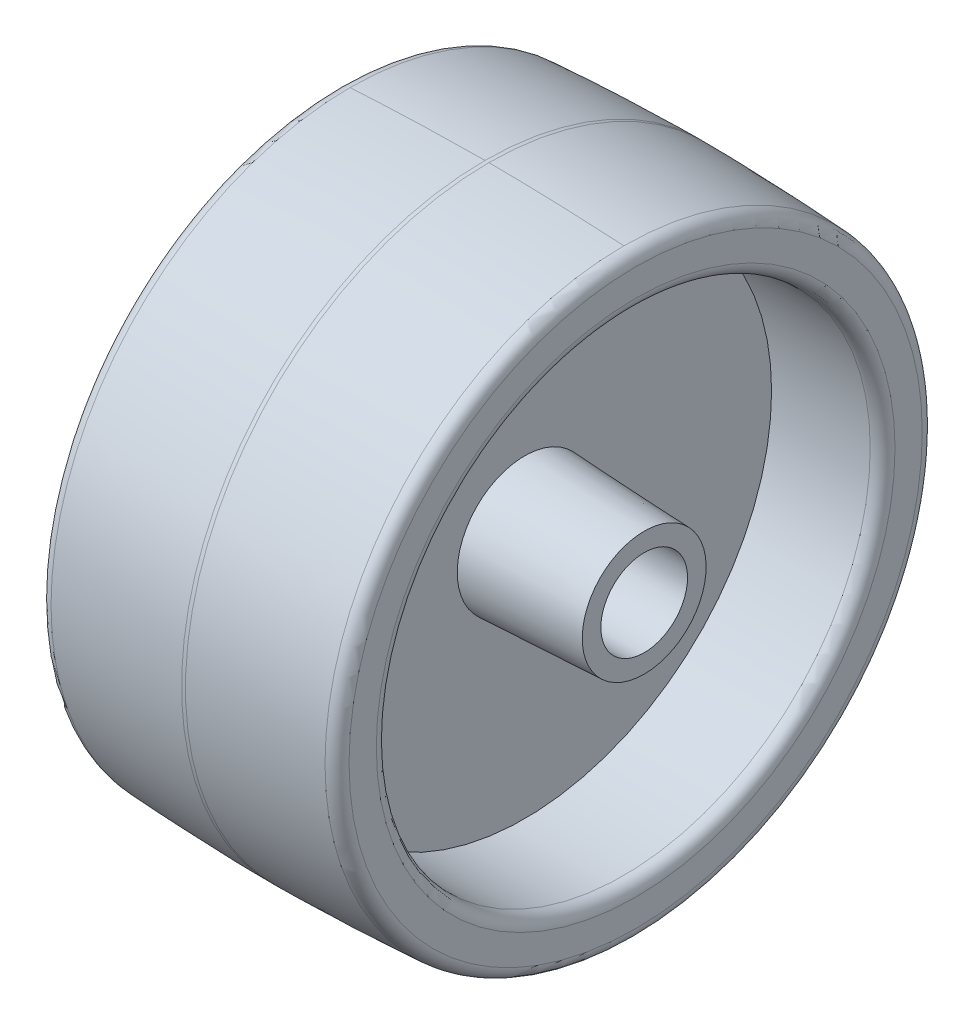
ISO-10303-21;
HEADER;
FILE_DESCRIPTION(('STEP AP214'),'2;1');
FILE_NAME('part.step','',(''),(''),'','','');
FILE_SCHEMA(('AUTOMOTIVE_DESIGN { 1 0 10303 214 1 1 1 1 }'));
ENDSEC;
DATA;
#1=APPLICATION_CONTEXT('core data for automotive mechanical design processes');
#2=APPLICATION_PROTOCOL_DEFINITION('international standard','automotive_design',2000,#1);
#3=PRODUCT_CONTEXT('',#1,'mechanical');
#4=PRODUCT('Part','Part','',(#3));
#5=PRODUCT_RELATED_PRODUCT_CATEGORY('part','',(#4));
#6=PRODUCT_DEFINITION_FORMATION('','',#4);
#7=PRODUCT_DEFINITION_CONTEXT('part definition',#1,'design');
#8=PRODUCT_DEFINITION('design','',#6,#7);
#9=PRODUCT_DEFINITION_SHAPE('','',#8);
#10=(LENGTH_UNIT() NAMED_UNIT(*) SI_UNIT(.MILLI.,.METRE.));
#11=(NAMED_UNIT(*) PLANE_ANGLE_UNIT() SI_UNIT($,.RADIAN.));
#12=(NAMED_UNIT(*) SI_UNIT($,.STERADIAN.) SOLID_ANGLE_UNIT());
#13=UNCERTAINTY_MEASURE_WITH_UNIT(LENGTH_MEASURE(1.E-05),#10,'distance_accuracy_value','');
#14=(GEOMETRIC_REPRESENTATION_CONTEXT(3) GLOBAL_UNCERTAINTY_ASSIGNED_CONTEXT((#13)) GLOBAL_UNIT_ASSIGNED_CONTEXT((#10,
#11,#12)) REPRESENTATION_CONTEXT('',''));
#15=CARTESIAN_POINT('',(0.,0.,0.));
#16=DIRECTION('',(0.,0.,1.));
#17=DIRECTION('',(1.,0.,0.));
#18=AXIS2_PLACEMENT_3D('',#15,#16,#17);
#19=CARTESIAN_POINT('',(6.,12.0397449804154,0.));
#20=DIRECTION('',(-1.,0.,0.));
#21=DIRECTION('',(0.,0.,1.));
#22=AXIS2_PLACEMENT_3D('',#19,#20,#21);
#23=PLANE('',#22);
#24=CARTESIAN_POINT('',(6.,0.,0.));
#25=DIRECTION('',(-1.,0.,0.));
#26=DIRECTION('',(0.,0.,1.));
#27=AXIS2_PLACEMENT_3D('',#24,#25,#26);
#28=CIRCLE('',#27,11.5692509922385);
#29=CARTESIAN_POINT('',(6.,0.,11.5692509922385));
#30=VERTEX_POINT('',#29);
#31=CARTESIAN_POINT('',(6.,0.,-11.5692509922385));
#32=VERTEX_POINT('',#31);
#33=EDGE_CURVE('E88',#30,#32,#28,.T.);
#34=ORIENTED_EDGE('',*,*,#33,.F.);
#35=CARTESIAN_POINT('',(6.,0.,0.));
#36=DIRECTION('',(-1.,0.,0.));
#37=DIRECTION('',(0.,0.,-1.));
#38=AXIS2_PLACEMENT_3D('',#35,#36,#37);
#39=CIRCLE('',#38,11.5692509922385);
#40=EDGE_CURVE('E125',#32,#30,#39,.T.);
#41=ORIENTED_EDGE('',*,*,#40,.F.);
#42=EDGE_LOOP('',(#34,#41));
#43=FACE_BOUND('',#42,.T.);
#44=CARTESIAN_POINT('',(6.,0.,0.));
#45=DIRECTION('',(1.,0.,0.));
#46=DIRECTION('',(0.,0.,1.));
#47=AXIS2_PLACEMENT_3D('',#44,#45,#46);
#48=CIRCLE('',#47,10.4691388913538);
#49=CARTESIAN_POINT('',(6.,0.,10.4691388913538));
#50=VERTEX_POINT('',#49);
#51=CARTESIAN_POINT('',(6.,0.,-10.4691388913538));
#52=VERTEX_POINT('',#51);
#53=EDGE_CURVE('E79',#50,#52,#48,.T.);
#54=ORIENTED_EDGE('',*,*,#53,.F.);
#55=CARTESIAN_POINT('',(6.,0.,0.));
#56=DIRECTION('',(1.,0.,0.));
#57=DIRECTION('',(0.,0.,-1.));
#58=AXIS2_PLACEMENT_3D('',#55,#56,#57);
#59=CIRCLE('',#58,10.4691388913538);
#60=EDGE_CURVE('E82',#52,#50,#59,.T.);
#61=ORIENTED_EDGE('',*,*,#60,.F.);
#62=EDGE_LOOP('',(#54,#61));
#63=FACE_BOUND('',#62,.T.);
#64=ADVANCED_FACE('F16',(#43,#63),#23,.F.);
#65=CARTESIAN_POINT('',(5.5,0.,0.));
#66=DIRECTION('',(-1.,0.,0.));
#67=DIRECTION('',(0.,0.,1.));
#68=AXIS2_PLACEMENT_3D('',#65,#66,#67);
#69=TOROIDAL_SURFACE('',#68,10.4691388913538,0.5);
#70=ORIENTED_EDGE('',*,*,#53,.T.);
#71=ORIENTED_EDGE('',*,*,#60,.T.);
#72=EDGE_LOOP('',(#70,#71));
#73=FACE_BOUND('',#72,.T.);
#74=CARTESIAN_POINT('',(5.5,0.,0.));
#75=DIRECTION('',(-1.,0.,0.));
#76=DIRECTION('',(0.,0.,1.));
#77=AXIS2_PLACEMENT_3D('',#74,#75,#76);
#78=CIRCLE('',#77,9.9691388913538);
#79=CARTESIAN_POINT('',(5.5,0.,9.9691388913538));
#80=VERTEX_POINT('',#79);
#81=EDGE_CURVE('E162',#80,#80,#78,.T.);
#82=ORIENTED_EDGE('',*,*,#81,.T.);
#83=EDGE_LOOP('',(#82));
#84=FACE_BOUND('',#83,.T.);
#85=ADVANCED_FACE('F84',(#73,#84),#69,.T.);
#86=CARTESIAN_POINT('',(5.5,0.,0.));
#87=DIRECTION('',(-1.,0.,0.));
#88=DIRECTION('',(0.,0.,1.));
#89=AXIS2_PLACEMENT_3D('',#86,#87,#88);
#90=TOROIDAL_SURFACE('',#89,11.5692509922385,0.5);
#91=ORIENTED_EDGE('',*,*,#33,.T.);
#92=ORIENTED_EDGE('',*,*,#40,.T.);
#93=EDGE_LOOP('',(#91,#92));
#94=FACE_BOUND('',#93,.T.);
#95=CARTESIAN_POINT('',(5.5292785838241,0.,0.));
#96=DIRECTION('',(1.,0.,0.));
#97=DIRECTION('',(0.,0.,-1.));
#98=AXIS2_PLACEMENT_3D('',#95,#96,#97);
#99=CIRCLE('',#98,12.0683930206526);
#100=CARTESIAN_POINT('',(5.5292785838241,12.0683930206526,0.));
#101=VERTEX_POINT('',#100);
#102=CARTESIAN_POINT('',(5.52927858382318,-12.0683930206526,0.));
#103=VERTEX_POINT('',#102);
#104=EDGE_CURVE('E184',#101,#103,#99,.T.);
#105=ORIENTED_EDGE('',*,*,#104,.T.);
#106=CARTESIAN_POINT('',(5.5292785838241,0.,0.));
#107=DIRECTION('',(1.,0.,0.));
#108=DIRECTION('',(0.,0.,-1.));
#109=AXIS2_PLACEMENT_3D('',#106,#107,#108);
#110=CIRCLE('',#109,12.0683930206526);
#111=EDGE_CURVE('E159',#103,#101,#110,.T.);
#112=ORIENTED_EDGE('',*,*,#111,.T.);
#113=EDGE_LOOP('',(#105,#112));
#114=FACE_BOUND('',#113,.T.);
#115=ADVANCED_FACE('F138',(#94,#114),#90,.T.);
#116=CARTESIAN_POINT('',(-6.78964380219674,0.,0.));
#117=DIRECTION('',(-1.,0.,0.));
#118=DIRECTION('',(0.,0.,1.));
#119=AXIS2_PLACEMENT_3D('',#116,#117,#118);
#120=CYLINDRICAL_SURFACE('',#119,9.9691388913538);
#121=ORIENTED_EDGE('',*,*,#81,.F.);
#122=EDGE_LOOP('',(#121));
#123=FACE_BOUND('',#122,.T.);
#124=CARTESIAN_POINT('',(1.51776760680963,0.,0.));
#125=DIRECTION('',(-1.,0.,0.));
#126=DIRECTION('',(0.,0.,1.));
#127=AXIS2_PLACEMENT_3D('',#124,#125,#126);
#128=CIRCLE('',#127,9.9691388913538);
#129=CARTESIAN_POINT('',(1.51776760680963,0.,9.9691388913538));
#130=VERTEX_POINT('',#129);
#131=EDGE_CURVE('E194',#130,#130,#128,.T.);
#132=ORIENTED_EDGE('',*,*,#131,.T.);
#133=EDGE_LOOP('',(#132));
#134=FACE_BOUND('',#133,.T.);
#135=ADVANCED_FACE('F148',(#123,#134),#120,.F.);
#136=CARTESIAN_POINT('',(5.5292785838241,12.0683930206526,0.));
#137=CARTESIAN_POINT('',(5.5292785838241,12.0683930206526,-24.1367860413051));
#138=CARTESIAN_POINT('',(5.5292785838241,-12.0683930206526,-24.1367860413051));
#139=CARTESIAN_POINT('',(5.5292785838241,-12.0683930206526,0.));
#140=CARTESIAN_POINT('',(2.80619779569895,12.2281230064508,0.));
#141=CARTESIAN_POINT('',(2.80619779569895,12.2281230064508,-24.4562460129016));
#142=CARTESIAN_POINT('',(2.80619779569895,-12.2281230064508,-24.4562460129016));
#143=CARTESIAN_POINT('',(2.80619779569895,-12.2281230064508,0.));
#144=CARTESIAN_POINT('',(0.078058168729048,12.2494190135837,0.));
#145=CARTESIAN_POINT('',(0.078058168729048,12.2494190135837,-24.4988380271673));
#146=CARTESIAN_POINT('',(0.078058168729048,-12.2494190135836,-24.4988380271673));
#147=CARTESIAN_POINT('',(0.078058168729048,-12.2494190135837,0.));
#148=(BOUNDED_SURFACE() B_SPLINE_SURFACE(2,3,((#136,#137,#138,#139),(#140,#141,#142,#143),(#144,
#145,#146,#147)),.UNSPECIFIED.,.F.,.F.,.F.) B_SPLINE_SURFACE_WITH_KNOTS((3,3),(4,4),
(0.0785274918999168,0.987003409723327),(0.,1.),
.UNSPECIFIED.) GEOMETRIC_REPRESENTATION_ITEM() RATIONAL_B_SPLINE_SURFACE(((1.,0.333333333333333,
0.333333333333333,1.),(1.,0.333333333333333,0.333333333333333,1.),(1.,0.333333333333333,
0.333333333333333,1.))) REPRESENTATION_ITEM('') SURFACE());
#149=CARTESIAN_POINT('',(5.5292785838241,-12.0683930206526,0.));
#150=CARTESIAN_POINT('',(2.80619779569895,-12.2281230064508,0.));
#151=CARTESIAN_POINT('',(0.078058168729048,-12.2494190135837,0.));
#152=B_SPLINE_CURVE_WITH_KNOTS('',2,(#149,#150,#151),.UNSPECIFIED.,.F.,.F.,(3,3),
(0.0785274918999168,0.987003409723327),.UNSPECIFIED.);
#153=CARTESIAN_POINT('',(0.0780581687290476,-12.2494190135837,0.));
#154=VERTEX_POINT('',#153);
#155=EDGE_CURVE('E191',#103,#154,#152,.T.);
#156=CARTESIAN_POINT('',(0.0780581687290465,0.,0.));
#157=DIRECTION('',(1.,0.,0.));
#158=DIRECTION('',(0.,0.,-1.));
#159=AXIS2_PLACEMENT_3D('',#156,#157,#158);
#160=CIRCLE('',#159,12.2494190135837);
#161=CARTESIAN_POINT('',(0.078058168729047,12.2494190135837,0.));
#162=VERTEX_POINT('',#161);
#163=EDGE_CURVE('E206',#162,#154,#160,.F.);
#164=CARTESIAN_POINT('',(5.5292785838241,12.0683930206526,0.));
#165=CARTESIAN_POINT('',(2.80619779569895,12.2281230064508,0.));
#166=CARTESIAN_POINT('',(0.078058168729048,12.2494190135837,0.));
#167=B_SPLINE_CURVE_WITH_KNOTS('',2,(#164,#165,#166),.UNSPECIFIED.,.F.,.F.,(3,3),
(0.0785274918999168,0.987003409723327),.UNSPECIFIED.);
#168=EDGE_CURVE('E161',#162,#101,#167,.F.);
#169=ORIENTED_EDGE('',*,*,#155,.T.);
#170=ORIENTED_EDGE('',*,*,#163,.F.);
#171=ORIENTED_EDGE('',*,*,#168,.T.);
#172=ORIENTED_EDGE('',*,*,#111,.F.);
#173=EDGE_LOOP('',(#169,#170,#171,#172));
#174=FACE_BOUND('',#173,.T.);
#175=ADVANCED_FACE('F235',(#174),#148,.F.);
#176=CARTESIAN_POINT('',(5.5292785838241,-12.0683930206526,0.));
#177=CARTESIAN_POINT('',(5.5292785838241,-12.0683930206526,24.1367860413051));
#178=CARTESIAN_POINT('',(5.5292785838241,12.0683930206526,24.1367860413051));
#179=CARTESIAN_POINT('',(5.5292785838241,12.0683930206526,0.));
#180=CARTESIAN_POINT('',(2.80619779569895,-12.2281230064508,0.));
#181=CARTESIAN_POINT('',(2.80619779569895,-12.2281230064508,24.4562460129016));
#182=CARTESIAN_POINT('',(2.80619779569895,12.2281230064508,24.4562460129017));
#183=CARTESIAN_POINT('',(2.80619779569895,12.2281230064508,0.));
#184=CARTESIAN_POINT('',(0.078058168729048,-12.2494190135837,0.));
#185=CARTESIAN_POINT('',(0.078058168729048,-12.2494190135837,24.4988380271673));
#186=CARTESIAN_POINT('',(0.078058168729048,12.2494190135836,24.4988380271673));
#187=CARTESIAN_POINT('',(0.078058168729048,12.2494190135837,0.));
#188=(BOUNDED_SURFACE() B_SPLINE_SURFACE(2,3,((#176,#177,#178,#179),(#180,#181,#182,#183),(#184,
#185,#186,#187)),.UNSPECIFIED.,.F.,.F.,.F.) B_SPLINE_SURFACE_WITH_KNOTS((3,3),(4,4),
(0.0785274918999168,0.987003409723327),(0.,1.),
.UNSPECIFIED.) GEOMETRIC_REPRESENTATION_ITEM() RATIONAL_B_SPLINE_SURFACE(((1.,0.333333333333333,
0.333333333333333,1.),(1.,0.333333333333333,0.333333333333333,1.),(1.,0.333333333333333,
0.333333333333333,1.))) REPRESENTATION_ITEM('') SURFACE());
#189=CARTESIAN_POINT('',(0.0780581687290465,0.,0.));
#190=DIRECTION('',(1.,0.,0.));
#191=DIRECTION('',(0.,0.,-1.));
#192=AXIS2_PLACEMENT_3D('',#189,#190,#191);
#193=CIRCLE('',#192,12.2494190135837);
#194=EDGE_CURVE('E203',#154,#162,#193,.F.);
#195=ORIENTED_EDGE('',*,*,#104,.F.);
#196=ORIENTED_EDGE('',*,*,#168,.F.);
#197=ORIENTED_EDGE('',*,*,#194,.F.);
#198=ORIENTED_EDGE('',*,*,#155,.F.);
#199=EDGE_LOOP('',(#195,#196,#197,#198));
#200=FACE_BOUND('',#199,.T.);
#201=ADVANCED_FACE('F230',(#200),#188,.F.);
#202=CARTESIAN_POINT('',(1.51776760680963,9.9691388913538,0.));
#203=DIRECTION('',(-1.,0.,0.));
#204=DIRECTION('',(0.,0.,1.));
#205=AXIS2_PLACEMENT_3D('',#202,#203,#204);
#206=PLANE('',#205);
#207=CARTESIAN_POINT('',(1.51776760679923,0.,0.));
#208=DIRECTION('',(-1.,0.,0.));
#209=DIRECTION('',(0.,-1.,0.));
#210=AXIS2_PLACEMENT_3D('',#207,#208,#209);
#211=CIRCLE('',#210,2.71825356087579);
#212=CARTESIAN_POINT('',(1.51776760679923,-2.71825356087579,0.));
#213=VERTEX_POINT('',#212);
#214=EDGE_CURVE('E205',#213,#213,#211,.F.);
#215=ORIENTED_EDGE('',*,*,#214,.F.);
#216=EDGE_LOOP('',(#215));
#217=FACE_BOUND('',#216,.T.);
#218=ORIENTED_EDGE('',*,*,#131,.F.);
#219=EDGE_LOOP('',(#218));
#220=FACE_BOUND('',#219,.T.);
#221=ADVANCED_FACE('F225',(#217,#220),#206,.F.);
#222=CARTESIAN_POINT('',(1.2490009027033E-13,0.,-2.24972367210976));
#223=DIRECTION('',(0.,1.,0.));
#224=DIRECTION('',(0.,0.,-1.));
#225=AXIS2_PLACEMENT_3D('',#222,#223,#224);
#226=CIRCLE('',#225,10.);
#227=TRIMMED_CURVE('',#226,(PARAMETER_VALUE(-1.79771100309246)),
(PARAMETER_VALUE(1.79771100309246)),.T.,.PARAMETER.);
#228=CARTESIAN_POINT('',(1.2490009027033E-13,0.,0.));
#229=DIRECTION('',(1.,0.,0.));
#230=AXIS1_PLACEMENT('',#228,#229);
#231=SURFACE_OF_REVOLUTION('',#227,#230);
#232=CARTESIAN_POINT('',(-0.0780581687287774,0.,0.));
#233=DIRECTION('',(1.,0.,0.));
#234=DIRECTION('',(0.,0.,-1.));
#235=AXIS2_PLACEMENT_3D('',#232,#233,#234);
#236=CIRCLE('',#235,12.2494190135837);
#237=CARTESIAN_POINT('',(-0.0780581687287774,-12.2494190135837,0.));
#238=VERTEX_POINT('',#237);
#239=CARTESIAN_POINT('',(-0.0780581687287774,12.2494190135837,0.));
#240=VERTEX_POINT('',#239);
#241=EDGE_CURVE('E371',#238,#240,#236,.T.);
#242=ORIENTED_EDGE('',*,*,#241,.T.);
#243=CARTESIAN_POINT('',(-0.0780581687287774,0.,0.));
#244=DIRECTION('',(1.,0.,0.));
#245=DIRECTION('',(0.,0.,-1.));
#246=AXIS2_PLACEMENT_3D('',#243,#244,#245);
#247=CIRCLE('',#246,12.2494190135837);
#248=EDGE_CURVE('E370',#240,#238,#247,.T.);
#249=ORIENTED_EDGE('',*,*,#248,.T.);
#250=EDGE_LOOP('',(#242,#249));
#251=FACE_BOUND('',#250,.T.);
#252=ORIENTED_EDGE('',*,*,#163,.T.);
#253=ORIENTED_EDGE('',*,*,#194,.T.);
#254=EDGE_LOOP('',(#252,#253));
#255=FACE_BOUND('',#254,.T.);
#256=ADVANCED_FACE('F220',(#251,#255),#231,.F.);
#257=CARTESIAN_POINT('',(1.51776760696976,0.,0.));
#258=DIRECTION('',(-1.,0.,0.));
#259=DIRECTION('',(0.,-1.,0.));
#260=AXIS2_PLACEMENT_3D('',#257,#258,#259);
#261=CONICAL_SURFACE('',#260,2.71825356086808,0.0451880638465196);
#262=ORIENTED_EDGE('',*,*,#214,.T.);
#263=EDGE_LOOP('',(#262));
#264=FACE_BOUND('',#263,.T.);
#265=CARTESIAN_POINT('',(6.3443737276998,0.,0.));
#266=DIRECTION('',(-1.,0.,0.));
#267=DIRECTION('',(0.,-1.,0.));
#268=AXIS2_PLACEMENT_3D('',#265,#266,#267);
#269=CIRCLE('',#268,2.5000000000009);
#270=CARTESIAN_POINT('',(6.3443737276998,-2.5000000000009,0.));
#271=VERTEX_POINT('',#270);
#272=EDGE_CURVE('E364',#271,#271,#269,.T.);
#273=ORIENTED_EDGE('',*,*,#272,.T.);
#274=EDGE_LOOP('',(#273));
#275=FACE_BOUND('',#274,.T.);
#276=ADVANCED_FACE('F224',(#264,#275),#261,.T.);
#277=CARTESIAN_POINT('',(-0.0780581687287774,12.2494190135837,0.));
#278=CARTESIAN_POINT('',(-0.0780581687287774,12.2494190135837,-24.4988380271673));
#279=CARTESIAN_POINT('',(-0.0780581687287774,-12.2494190135837,-24.4988380271673));
#280=CARTESIAN_POINT('',(-0.0780581687287774,-12.2494190135837,0.));
#281=CARTESIAN_POINT('',(-2.80619779569882,12.2281230064508,0.));
#282=CARTESIAN_POINT('',(-2.80619779569882,12.2281230064508,-24.4562460129017));
#283=CARTESIAN_POINT('',(-2.80619779569882,-12.2281230064508,-24.4562460129017));
#284=CARTESIAN_POINT('',(-2.80619779569882,-12.2281230064508,0.));
#285=CARTESIAN_POINT('',(-5.52927858382411,12.0683930206526,0.));
#286=CARTESIAN_POINT('',(-5.52927858382411,12.0683930206526,-24.1367860413051));
#287=CARTESIAN_POINT('',(-5.52927858382411,-12.0683930206526,-24.1367860413051));
#288=CARTESIAN_POINT('',(-5.52927858382411,-12.0683930206526,0.));
#289=(BOUNDED_SURFACE() B_SPLINE_SURFACE(2,3,((#277,#278,#279,#280),(#281,#282,#283,#284),(#285,
#286,#287,#288)),.UNSPECIFIED.,.F.,.F.,.F.) B_SPLINE_SURFACE_WITH_KNOTS((3,3),(4,4),
(0.0129965902766276,0.921472508100085),(0.,1.),
.UNSPECIFIED.) GEOMETRIC_REPRESENTATION_ITEM() RATIONAL_B_SPLINE_SURFACE(((1.,0.333333333333333,
0.333333333333333,1.),(1.,0.333333333333333,0.333333333333333,1.),(1.,0.333333333333333,
0.333333333333333,1.))) REPRESENTATION_ITEM('') SURFACE());
#290=CARTESIAN_POINT('',(-0.0780581687287774,-12.2494190135837,0.));
#291=CARTESIAN_POINT('',(-2.80619779569882,-12.2281230064508,0.));
#292=CARTESIAN_POINT('',(-5.52927858382411,-12.0683930206526,0.));
#293=B_SPLINE_CURVE_WITH_KNOTS('',2,(#290,#291,#292),.UNSPECIFIED.,.F.,.F.,(3,3),
(0.0129965902766276,0.921472508100085),.UNSPECIFIED.);
#294=CARTESIAN_POINT('',(-5.52927858382288,-12.0683930206526,0.));
#295=VERTEX_POINT('',#294);
#296=EDGE_CURVE('E376',#238,#295,#293,.T.);
#297=CARTESIAN_POINT('',(-5.52927858382226,0.,0.));
#298=DIRECTION('',(-1.,0.,0.));
#299=DIRECTION('',(0.,0.,1.));
#300=AXIS2_PLACEMENT_3D('',#297,#298,#299);
#301=CIRCLE('',#300,12.0683930206527);
#302=CARTESIAN_POINT('',(-5.52927858382288,12.0683930206526,0.));
#303=VERTEX_POINT('',#302);
#304=EDGE_CURVE('E360',#303,#295,#301,.T.);
#305=CARTESIAN_POINT('',(-0.0780581687287774,12.2494190135837,0.));
#306=CARTESIAN_POINT('',(-2.80619779569882,12.2281230064508,0.));
#307=CARTESIAN_POINT('',(-5.52927858382411,12.0683930206526,0.));
#308=B_SPLINE_CURVE_WITH_KNOTS('',2,(#305,#306,#307),.UNSPECIFIED.,.F.,.F.,(3,3),
(0.0129965902766276,0.921472508100085),.UNSPECIFIED.);
#309=EDGE_CURVE('E367',#303,#240,#308,.F.);
#310=ORIENTED_EDGE('',*,*,#296,.T.);
#311=ORIENTED_EDGE('',*,*,#304,.F.);
#312=ORIENTED_EDGE('',*,*,#309,.T.);
#313=ORIENTED_EDGE('',*,*,#241,.F.);
#314=EDGE_LOOP('',(#310,#311,#312,#313));
#315=FACE_BOUND('',#314,.T.);
#316=ADVANCED_FACE('F400',(#315),#289,.F.);
#317=CARTESIAN_POINT('',(-0.0780581687287774,-12.2494190135837,0.));
#318=CARTESIAN_POINT('',(-0.0780581687287774,-12.2494190135837,24.4988380271673));
#319=CARTESIAN_POINT('',(-0.0780581687287774,12.2494190135836,24.4988380271673));
#320=CARTESIAN_POINT('',(-0.0780581687287774,12.2494190135837,0.));
#321=CARTESIAN_POINT('',(-2.80619779569882,-12.2281230064508,0.));
#322=CARTESIAN_POINT('',(-2.80619779569882,-12.2281230064508,24.4562460129017));
#323=CARTESIAN_POINT('',(-2.80619779569882,12.2281230064508,24.4562460129017));
#324=CARTESIAN_POINT('',(-2.80619779569882,12.2281230064508,0.));
#325=CARTESIAN_POINT('',(-5.52927858382411,-12.0683930206526,0.));
#326=CARTESIAN_POINT('',(-5.52927858382411,-12.0683930206526,24.1367860413051));
#327=CARTESIAN_POINT('',(-5.52927858382411,12.0683930206526,24.1367860413051));
#328=CARTESIAN_POINT('',(-5.52927858382411,12.0683930206526,0.));
#329=(BOUNDED_SURFACE() B_SPLINE_SURFACE(2,3,((#317,#318,#319,#320),(#321,#322,#323,#324),(#325,
#326,#327,#328)),.UNSPECIFIED.,.F.,.F.,.F.) B_SPLINE_SURFACE_WITH_KNOTS((3,3),(4,4),
(0.0129965902766276,0.921472508100085),(0.,1.),
.UNSPECIFIED.) GEOMETRIC_REPRESENTATION_ITEM() RATIONAL_B_SPLINE_SURFACE(((1.,0.333333333333333,
0.333333333333333,1.),(1.,0.333333333333333,0.333333333333333,1.),(1.,0.333333333333333,
0.333333333333333,1.))) REPRESENTATION_ITEM('') SURFACE());
#330=CARTESIAN_POINT('',(-5.52927858382226,0.,0.));
#331=DIRECTION('',(-1.,0.,0.));
#332=DIRECTION('',(0.,0.,1.));
#333=AXIS2_PLACEMENT_3D('',#330,#331,#332);
#334=CIRCLE('',#333,12.0683930206527);
#335=EDGE_CURVE('E351',#295,#303,#334,.T.);
#336=ORIENTED_EDGE('',*,*,#248,.F.);
#337=ORIENTED_EDGE('',*,*,#309,.F.);
#338=ORIENTED_EDGE('',*,*,#335,.F.);
#339=ORIENTED_EDGE('',*,*,#296,.F.);
#340=EDGE_LOOP('',(#336,#337,#338,#339));
#341=FACE_BOUND('',#340,.T.);
#342=ADVANCED_FACE('F396',(#341),#329,.F.);
#343=CARTESIAN_POINT('',(6.34437372771019,2.5,0.));
#344=DIRECTION('',(-1.,0.,0.));
#345=DIRECTION('',(0.,0.,1.));
#346=AXIS2_PLACEMENT_3D('',#343,#344,#345);
#347=PLANE('',#346);
#348=ORIENTED_EDGE('',*,*,#272,.F.);
#349=EDGE_LOOP('',(#348));
#350=FACE_BOUND('',#349,.T.);
#351=CARTESIAN_POINT('',(6.34437372771019,0.,0.));
#352=DIRECTION('',(1.,0.,0.));
#353=DIRECTION('',(0.,0.,-1.));
#354=AXIS2_PLACEMENT_3D('',#351,#352,#353);
#355=CIRCLE('',#354,1.75);
#356=CARTESIAN_POINT('',(6.34437372771019,0.,-1.75));
#357=VERTEX_POINT('',#356);
#358=EDGE_CURVE('E359',#357,#357,#355,.F.);
#359=ORIENTED_EDGE('',*,*,#358,.T.);
#360=EDGE_LOOP('',(#359));
#361=FACE_BOUND('',#360,.T.);
#362=ADVANCED_FACE('F344',(#350,#361),#347,.F.);
#363=CARTESIAN_POINT('',(-5.5,0.,0.));
#364=DIRECTION('',(-1.,0.,0.));
#365=DIRECTION('',(0.,0.,1.));
#366=AXIS2_PLACEMENT_3D('',#363,#364,#365);
#367=TOROIDAL_SURFACE('',#366,11.5692509922385,0.5);
#368=CARTESIAN_POINT('',(-6.,0.,0.));
#369=DIRECTION('',(1.,0.,0.));
#370=DIRECTION('',(0.,0.,1.));
#371=AXIS2_PLACEMENT_3D('',#368,#369,#370);
#372=CIRCLE('',#371,11.5692509922385);
#373=CARTESIAN_POINT('',(-6.,0.,11.5692509922385));
#374=VERTEX_POINT('',#373);
#375=CARTESIAN_POINT('',(-6.,0.,-11.5692509922385));
#376=VERTEX_POINT('',#375);
#377=EDGE_CURVE('E445',#374,#376,#372,.T.);
#378=ORIENTED_EDGE('',*,*,#377,.T.);
#379=CARTESIAN_POINT('',(-6.,0.,0.));
#380=DIRECTION('',(1.,0.,0.));
#381=DIRECTION('',(0.,0.,-1.));
#382=AXIS2_PLACEMENT_3D('',#379,#380,#381);
#383=CIRCLE('',#382,11.5692509922385);
#384=EDGE_CURVE('E320',#376,#374,#383,.T.);
#385=ORIENTED_EDGE('',*,*,#384,.T.);
#386=EDGE_LOOP('',(#378,#385));
#387=FACE_BOUND('',#386,.T.);
#388=ORIENTED_EDGE('',*,*,#304,.T.);
#389=ORIENTED_EDGE('',*,*,#335,.T.);
#390=EDGE_LOOP('',(#388,#389));
#391=FACE_BOUND('',#390,.T.);
#392=ADVANCED_FACE('F340',(#387,#391),#367,.T.);
#393=CARTESIAN_POINT('',(-6.34437372771019,0.,0.));
#394=DIRECTION('',(1.,0.,0.));
#395=DIRECTION('',(0.,0.,-1.));
#396=AXIS2_PLACEMENT_3D('',#393,#394,#395);
#397=CYLINDRICAL_SURFACE('',#396,1.75);
#398=CARTESIAN_POINT('',(-6.34437372771019,0.,0.));
#399=DIRECTION('',(1.,0.,0.));
#400=DIRECTION('',(0.,0.,-1.));
#401=AXIS2_PLACEMENT_3D('',#398,#399,#400);
#402=CIRCLE('',#401,1.75);
#403=CARTESIAN_POINT('',(-6.34437372771019,0.,-1.75));
#404=VERTEX_POINT('',#403);
#405=EDGE_CURVE('E446',#404,#404,#402,.F.);
#406=ORIENTED_EDGE('',*,*,#405,.T.);
#407=EDGE_LOOP('',(#406));
#408=FACE_BOUND('',#407,.T.);
#409=ORIENTED_EDGE('',*,*,#358,.F.);
#410=EDGE_LOOP('',(#409));
#411=FACE_BOUND('',#410,.T.);
#412=ADVANCED_FACE('F301',(#408,#411),#397,.F.);
#413=CARTESIAN_POINT('',(-6.,12.0397449804154,0.));
#414=DIRECTION('',(1.,0.,0.));
#415=DIRECTION('',(0.,0.,-1.));
#416=AXIS2_PLACEMENT_3D('',#413,#414,#415);
#417=PLANE('',#416);
#418=ORIENTED_EDGE('',*,*,#377,.F.);
#419=ORIENTED_EDGE('',*,*,#384,.F.);
#420=EDGE_LOOP('',(#418,#419));
#421=FACE_BOUND('',#420,.T.);
#422=CARTESIAN_POINT('',(-6.,0.,0.));
#423=DIRECTION('',(-1.,0.,0.));
#424=DIRECTION('',(0.,0.,-1.));
#425=AXIS2_PLACEMENT_3D('',#422,#423,#424);
#426=CIRCLE('',#425,10.4691388913538);
#427=CARTESIAN_POINT('',(-6.,0.,-10.4691388913538));
#428=VERTEX_POINT('',#427);
#429=CARTESIAN_POINT('',(-6.,0.,10.4691388913538));
#430=VERTEX_POINT('',#429);
#431=EDGE_CURVE('E287',#428,#430,#426,.T.);
#432=ORIENTED_EDGE('',*,*,#431,.F.);
#433=CARTESIAN_POINT('',(-6.,0.,0.));
#434=DIRECTION('',(-1.,0.,0.));
#435=DIRECTION('',(0.,0.,1.));
#436=AXIS2_PLACEMENT_3D('',#433,#434,#435);
#437=CIRCLE('',#436,10.4691388913538);
#438=EDGE_CURVE('E34',#430,#428,#437,.T.);
#439=ORIENTED_EDGE('',*,*,#438,.F.);
#440=EDGE_LOOP('',(#432,#439));
#441=FACE_BOUND('',#440,.T.);
#442=ADVANCED_FACE('F292',(#421,#441),#417,.F.);
#443=CARTESIAN_POINT('',(-6.34437372771019,2.5,0.));
#444=DIRECTION('',(1.,0.,0.));
#445=DIRECTION('',(0.,0.,-1.));
#446=AXIS2_PLACEMENT_3D('',#443,#444,#445);
#447=PLANE('',#446);
#448=CARTESIAN_POINT('',(-6.3443737276998,0.,0.));
#449=DIRECTION('',(1.,0.,0.));
#450=DIRECTION('',(0.,1.,0.));
#451=AXIS2_PLACEMENT_3D('',#448,#449,#450);
#452=CIRCLE('',#451,2.50000000000446);
#453=CARTESIAN_POINT('',(-6.3443737276998,2.50000000000446,0.));
#454=VERTEX_POINT('',#453);
#455=EDGE_CURVE('E459',#454,#454,#452,.T.);
#456=ORIENTED_EDGE('',*,*,#455,.F.);
#457=EDGE_LOOP('',(#456));
#458=FACE_BOUND('',#457,.T.);
#459=ORIENTED_EDGE('',*,*,#405,.F.);
#460=EDGE_LOOP('',(#459));
#461=FACE_BOUND('',#460,.T.);
#462=ADVANCED_FACE('F277',(#458,#461),#447,.F.);
#463=CARTESIAN_POINT('',(-5.5,0.,0.));
#464=DIRECTION('',(1.,0.,0.));
#465=DIRECTION('',(0.,0.,-1.));
#466=AXIS2_PLACEMENT_3D('',#463,#464,#465);
#467=TOROIDAL_SURFACE('',#466,10.4691388913538,0.5);
#468=ORIENTED_EDGE('',*,*,#431,.T.);
#469=ORIENTED_EDGE('',*,*,#438,.T.);
#470=EDGE_LOOP('',(#468,#469));
#471=FACE_BOUND('',#470,.T.);
#472=CARTESIAN_POINT('',(-5.5,0.,0.));
#473=DIRECTION('',(-1.,0.,0.));
#474=DIRECTION('',(0.,0.,1.));
#475=AXIS2_PLACEMENT_3D('',#472,#473,#474);
#476=CIRCLE('',#475,9.9691388913538);
#477=CARTESIAN_POINT('',(-5.5,0.,9.9691388913538));
#478=VERTEX_POINT('',#477);
#479=EDGE_CURVE('E284',#478,#478,#476,.F.);
#480=ORIENTED_EDGE('',*,*,#479,.T.);
#481=EDGE_LOOP('',(#480));
#482=FACE_BOUND('',#481,.T.);
#483=ADVANCED_FACE('F271',(#471,#482),#467,.T.);
#484=CARTESIAN_POINT('',(-1.51776760696976,0.,0.));
#485=DIRECTION('',(1.,0.,0.));
#486=DIRECTION('',(0.,1.,0.));
#487=AXIS2_PLACEMENT_3D('',#484,#485,#486);
#488=CONICAL_SURFACE('',#487,2.71825356087163,0.0451880638465196);
#489=ORIENTED_EDGE('',*,*,#455,.T.);
#490=EDGE_LOOP('',(#489));
#491=FACE_BOUND('',#490,.T.);
#492=CARTESIAN_POINT('',(-1.51776760679923,0.,0.));
#493=DIRECTION('',(1.,0.,0.));
#494=DIRECTION('',(0.,1.,0.));
#495=AXIS2_PLACEMENT_3D('',#492,#493,#494);
#496=CIRCLE('',#495,2.71825356087934);
#497=CARTESIAN_POINT('',(-1.51776760679922,2.71825356087934,0.));
#498=VERTEX_POINT('',#497);
#499=EDGE_CURVE('E26',#498,#498,#496,.F.);
#500=ORIENTED_EDGE('',*,*,#499,.T.);
#501=EDGE_LOOP('',(#500));
#502=FACE_BOUND('',#501,.T.);
#503=ADVANCED_FACE('F263',(#491,#502),#488,.T.);
#504=CARTESIAN_POINT('',(-6.78964380219674,0.,0.));
#505=DIRECTION('',(-1.,0.,0.));
#506=DIRECTION('',(0.,0.,1.));
#507=AXIS2_PLACEMENT_3D('',#504,#505,#506);
#508=CYLINDRICAL_SURFACE('',#507,9.9691388913538);
#509=CARTESIAN_POINT('',(-1.51776760680963,0.,0.));
#510=DIRECTION('',(-1.,0.,0.));
#511=DIRECTION('',(0.,0.,1.));
#512=AXIS2_PLACEMENT_3D('',#509,#510,#511);
#513=CIRCLE('',#512,9.9691388913538);
#514=CARTESIAN_POINT('',(-1.51776760680963,0.,9.9691388913538));
#515=VERTEX_POINT('',#514);
#516=EDGE_CURVE('E10',#515,#515,#513,.F.);
#517=ORIENTED_EDGE('',*,*,#516,.T.);
#518=EDGE_LOOP('',(#517));
#519=FACE_BOUND('',#518,.T.);
#520=ORIENTED_EDGE('',*,*,#479,.F.);
#521=EDGE_LOOP('',(#520));
#522=FACE_BOUND('',#521,.T.);
#523=ADVANCED_FACE('F257',(#519,#522),#508,.F.);
#524=CARTESIAN_POINT('',(-1.51776760680963,9.9691388913538,0.));
#525=DIRECTION('',(1.,0.,0.));
#526=DIRECTION('',(0.,0.,-1.));
#527=AXIS2_PLACEMENT_3D('',#524,#525,#526);
#528=PLANE('',#527);
#529=ORIENTED_EDGE('',*,*,#516,.F.);
#530=EDGE_LOOP('',(#529));
#531=FACE_BOUND('',#530,.T.);
#532=ORIENTED_EDGE('',*,*,#499,.F.);
#533=EDGE_LOOP('',(#532));
#534=FACE_BOUND('',#533,.T.);
#535=ADVANCED_FACE('F255',(#531,#534),#528,.F.);
#536=CLOSED_SHELL('',(#64,#85,#115,#135,#175,#201,#221,#256,#276,#316,#342,#362,#392,#412,#442,
#462,#483,#503,#523,#535));
#537=MANIFOLD_SOLID_BREP('B1',#536);
#538=ADVANCED_BREP_SHAPE_REPRESENTATION('',(#18,#537),#14);
#539=SHAPE_DEFINITION_REPRESENTATION(#9,#538);
ENDSEC;
END-ISO-10303-21;
